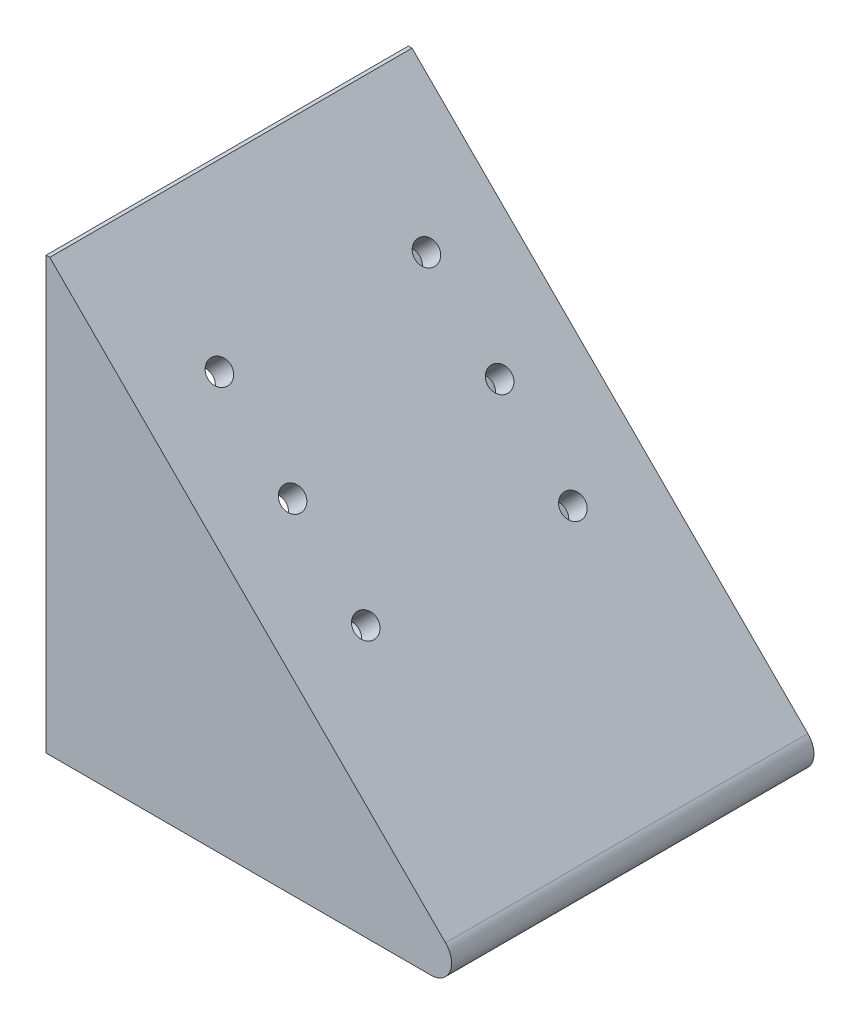
ISO-10303-21;
HEADER;
FILE_DESCRIPTION(('STEP AP214'),'2;1');
FILE_NAME('part.step','',(''),(''),'','','');
FILE_SCHEMA(('AUTOMOTIVE_DESIGN { 1 0 10303 214 1 1 1 1 }'));
ENDSEC;
DATA;
#1=APPLICATION_CONTEXT('core data for automotive mechanical design processes');
#2=APPLICATION_PROTOCOL_DEFINITION('international standard','automotive_design',2000,#1);
#3=PRODUCT_CONTEXT('',#1,'mechanical');
#4=PRODUCT('Part','Part','',(#3));
#5=PRODUCT_RELATED_PRODUCT_CATEGORY('part','',(#4));
#6=PRODUCT_DEFINITION_FORMATION('','',#4);
#7=PRODUCT_DEFINITION_CONTEXT('part definition',#1,'design');
#8=PRODUCT_DEFINITION('design','',#6,#7);
#9=PRODUCT_DEFINITION_SHAPE('','',#8);
#10=(LENGTH_UNIT() NAMED_UNIT(*) SI_UNIT(.MILLI.,.METRE.));
#11=(NAMED_UNIT(*) PLANE_ANGLE_UNIT() SI_UNIT($,.RADIAN.));
#12=(NAMED_UNIT(*) SI_UNIT($,.STERADIAN.) SOLID_ANGLE_UNIT());
#13=UNCERTAINTY_MEASURE_WITH_UNIT(LENGTH_MEASURE(1.E-05),#10,'distance_accuracy_value','');
#14=(GEOMETRIC_REPRESENTATION_CONTEXT(3) GLOBAL_UNCERTAINTY_ASSIGNED_CONTEXT((#13)) GLOBAL_UNIT_ASSIGNED_CONTEXT((#10,
#11,#12)) REPRESENTATION_CONTEXT('',''));
#15=CARTESIAN_POINT('',(0.,0.,0.));
#16=DIRECTION('',(0.,0.,1.));
#17=DIRECTION('',(1.,0.,0.));
#18=AXIS2_PLACEMENT_3D('',#15,#16,#17);
#19=CARTESIAN_POINT('',(0.,84.,70.));
#20=DIRECTION('',(1.,0.,0.));
#21=DIRECTION('',(0.,1.,0.));
#22=AXIS2_PLACEMENT_3D('',#19,#20,#21);
#23=PLANE('',#22);
#24=DIRECTION('',(0.,-1.,0.));
#25=VECTOR('',#24,1.);
#26=CARTESIAN_POINT('',(0.,84.,5.));
#27=LINE('',#26,#25);
#28=CARTESIAN_POINT('',(0.,76.9289321881346,5.));
#29=VERTEX_POINT('',#28);
#30=CARTESIAN_POINT('',(0.,5.,5.));
#31=VERTEX_POINT('',#30);
#32=EDGE_CURVE('E118',#29,#31,#27,.T.);
#33=ORIENTED_EDGE('',*,*,#32,.F.);
#34=DIRECTION('',(0.,0.,1.));
#35=VECTOR('',#34,1.);
#36=CARTESIAN_POINT('',(0.,76.9289321881345,70.));
#37=LINE('',#36,#35);
#38=CARTESIAN_POINT('',(0.,76.9289321881345,65.));
#39=VERTEX_POINT('',#38);
#40=EDGE_CURVE('E111',#29,#39,#37,.T.);
#41=ORIENTED_EDGE('',*,*,#40,.T.);
#42=DIRECTION('',(0.,-1.,0.));
#43=VECTOR('',#42,1.);
#44=CARTESIAN_POINT('',(0.,84.,65.));
#45=LINE('',#44,#43);
#46=CARTESIAN_POINT('',(0.,5.,65.));
#47=VERTEX_POINT('',#46);
#48=EDGE_CURVE('E114',#39,#47,#45,.T.);
#49=ORIENTED_EDGE('',*,*,#48,.T.);
#50=DIRECTION('',(0.,0.,-1.));
#51=VECTOR('',#50,1.);
#52=CARTESIAN_POINT('',(0.,5.,70.));
#53=LINE('',#52,#51);
#54=EDGE_CURVE('E52',#47,#31,#53,.T.);
#55=ORIENTED_EDGE('',*,*,#54,.T.);
#56=EDGE_LOOP('',(#33,#41,#49,#55));
#57=FACE_BOUND('',#56,.T.);
#58=DIRECTION('',(0.,-1.,0.));
#59=VECTOR('',#58,1.);
#60=CARTESIAN_POINT('',(0.,84.,70.));
#61=LINE('',#60,#59);
#62=CARTESIAN_POINT('',(0.,83.2928932188135,70.));
#63=VERTEX_POINT('',#62);
#64=CARTESIAN_POINT('',(0.,0.,70.));
#65=VERTEX_POINT('',#64);
#66=EDGE_CURVE('E135',#63,#65,#61,.T.);
#67=ORIENTED_EDGE('',*,*,#66,.F.);
#68=DIRECTION('',(0.,0.,-1.));
#69=VECTOR('',#68,1.);
#70=CARTESIAN_POINT('',(0.,83.2928932188135,70.));
#71=LINE('',#70,#69);
#72=CARTESIAN_POINT('',(0.,83.2928932188135,0.));
#73=VERTEX_POINT('',#72);
#74=EDGE_CURVE('E160',#63,#73,#71,.T.);
#75=ORIENTED_EDGE('',*,*,#74,.T.);
#76=DIRECTION('',(0.,-1.,0.));
#77=VECTOR('',#76,1.);
#78=CARTESIAN_POINT('',(0.,84.,0.));
#79=LINE('',#78,#77);
#80=CARTESIAN_POINT('',(0.,0.,0.));
#81=VERTEX_POINT('',#80);
#82=EDGE_CURVE('E123',#73,#81,#79,.T.);
#83=ORIENTED_EDGE('',*,*,#82,.T.);
#84=DIRECTION('',(0.,0.,-1.));
#85=VECTOR('',#84,1.);
#86=CARTESIAN_POINT('',(0.,0.,70.));
#87=LINE('',#86,#85);
#88=EDGE_CURVE('E143',#65,#81,#87,.T.);
#89=ORIENTED_EDGE('',*,*,#88,.F.);
#90=EDGE_LOOP('',(#67,#75,#83,#89));
#91=FACE_BOUND('',#90,.T.);
#92=ADVANCED_FACE('F35',(#57,#91),#23,.F.);
#93=CARTESIAN_POINT('',(0.,0.,70.));
#94=DIRECTION('',(0.,1.,0.));
#95=DIRECTION('',(0.,0.,1.));
#96=AXIS2_PLACEMENT_3D('',#93,#94,#95);
#97=PLANE('',#96);
#98=DIRECTION('',(1.,0.,0.));
#99=VECTOR('',#98,1.);
#100=CARTESIAN_POINT('',(0.,0.,0.));
#101=LINE('',#100,#99);
#102=CARTESIAN_POINT('',(74.3431457505076,0.,0.));
#103=VERTEX_POINT('',#102);
#104=EDGE_CURVE('E145',#81,#103,#101,.T.);
#105=ORIENTED_EDGE('',*,*,#104,.T.);
#106=DIRECTION('',(0.,0.,-1.));
#107=VECTOR('',#106,1.);
#108=CARTESIAN_POINT('',(74.3431457505076,0.,70.));
#109=LINE('',#108,#107);
#110=CARTESIAN_POINT('',(74.3431457505076,0.,70.));
#111=VERTEX_POINT('',#110);
#112=EDGE_CURVE('E156',#103,#111,#109,.F.);
#113=ORIENTED_EDGE('',*,*,#112,.T.);
#114=DIRECTION('',(1.,0.,0.));
#115=VECTOR('',#114,1.);
#116=CARTESIAN_POINT('',(0.,0.,70.));
#117=LINE('',#116,#115);
#118=EDGE_CURVE('E137',#65,#111,#117,.T.);
#119=ORIENTED_EDGE('',*,*,#118,.F.);
#120=ORIENTED_EDGE('',*,*,#88,.T.);
#121=EDGE_LOOP('',(#105,#113,#119,#120));
#122=FACE_BOUND('',#121,.T.);
#123=ADVANCED_FACE('F210',(#122),#97,.F.);
#124=CARTESIAN_POINT('',(84.,0.,70.));
#125=DIRECTION('',(-0.707106781186548,-0.707106781186548,0.));
#126=DIRECTION('',(0.707106781186548,-0.707106781186548,0.));
#127=AXIS2_PLACEMENT_3D('',#124,#125,#126);
#128=PLANE('',#127);
#129=CARTESIAN_POINT('',(18.4817100367704,65.5182899632297,55.));
#130=DIRECTION('',(0.707106781186548,0.707106781186547,0.));
#131=DIRECTION('',(-0.707106781186547,0.707106781186548,0.));
#132=AXIS2_PLACEMENT_3D('',#129,#130,#131);
#133=CIRCLE('',#132,2.25);
#134=CARTESIAN_POINT('',(16.8907197791006,67.1092802208994,55.));
#135=VERTEX_POINT('',#134);
#136=EDGE_CURVE('E287',#135,#135,#133,.T.);
#137=ORIENTED_EDGE('',*,*,#136,.F.);
#138=EDGE_LOOP('',(#137));
#139=FACE_BOUND('',#138,.T.);
#140=CARTESIAN_POINT('',(32.6238456605013,51.3761543394987,55.));
#141=DIRECTION('',(0.707106781186548,0.707106781186547,0.));
#142=DIRECTION('',(-0.707106781186547,0.707106781186548,0.));
#143=AXIS2_PLACEMENT_3D('',#140,#141,#142);
#144=CIRCLE('',#143,2.25);
#145=CARTESIAN_POINT('',(31.0328554028316,52.9671445971685,55.));
#146=VERTEX_POINT('',#145);
#147=EDGE_CURVE('E289',#146,#146,#144,.T.);
#148=ORIENTED_EDGE('',*,*,#147,.F.);
#149=EDGE_LOOP('',(#148));
#150=FACE_BOUND('',#149,.T.);
#151=CARTESIAN_POINT('',(46.7659812842323,37.2340187157678,55.));
#152=DIRECTION('',(0.707106781186548,0.707106781186547,0.));
#153=DIRECTION('',(-0.707106781186547,0.707106781186548,0.));
#154=AXIS2_PLACEMENT_3D('',#151,#152,#153);
#155=CIRCLE('',#154,2.25);
#156=CARTESIAN_POINT('',(45.1749910265625,38.8250089734375,55.));
#157=VERTEX_POINT('',#156);
#158=EDGE_CURVE('E180',#157,#157,#155,.T.);
#159=ORIENTED_EDGE('',*,*,#158,.F.);
#160=EDGE_LOOP('',(#159));
#161=FACE_BOUND('',#160,.T.);
#162=CARTESIAN_POINT('',(46.7659812842323,37.2340187157678,15.));
#163=DIRECTION('',(0.707106781186548,0.707106781186547,0.));
#164=DIRECTION('',(-0.707106781186547,0.707106781186548,0.));
#165=AXIS2_PLACEMENT_3D('',#162,#163,#164);
#166=CIRCLE('',#165,2.25);
#167=CARTESIAN_POINT('',(45.1749910265625,38.8250089734375,15.));
#168=VERTEX_POINT('',#167);
#169=EDGE_CURVE('E168',#168,#168,#166,.T.);
#170=ORIENTED_EDGE('',*,*,#169,.F.);
#171=EDGE_LOOP('',(#170));
#172=FACE_BOUND('',#171,.T.);
#173=CARTESIAN_POINT('',(32.6238456605013,51.3761543394987,15.));
#174=DIRECTION('',(0.707106781186548,0.707106781186547,0.));
#175=DIRECTION('',(-0.707106781186547,0.707106781186548,0.));
#176=AXIS2_PLACEMENT_3D('',#173,#174,#175);
#177=CIRCLE('',#176,2.25);
#178=CARTESIAN_POINT('',(31.0328554028316,52.9671445971685,15.));
#179=VERTEX_POINT('',#178);
#180=EDGE_CURVE('E167',#179,#179,#177,.T.);
#181=ORIENTED_EDGE('',*,*,#180,.F.);
#182=EDGE_LOOP('',(#181));
#183=FACE_BOUND('',#182,.T.);
#184=CARTESIAN_POINT('',(18.4817100367704,65.5182899632297,15.));
#185=DIRECTION('',(0.707106781186548,0.707106781186547,0.));
#186=DIRECTION('',(-0.707106781186547,0.707106781186548,0.));
#187=AXIS2_PLACEMENT_3D('',#184,#185,#186);
#188=CIRCLE('',#187,2.25);
#189=CARTESIAN_POINT('',(16.8907197791006,67.1092802208994,15.));
#190=VERTEX_POINT('',#189);
#191=EDGE_CURVE('E186',#190,#190,#188,.T.);
#192=ORIENTED_EDGE('',*,*,#191,.F.);
#193=EDGE_LOOP('',(#192));
#194=FACE_BOUND('',#193,.T.);
#195=DIRECTION('',(-0.707106781186548,0.707106781186548,0.));
#196=VECTOR('',#195,1.);
#197=CARTESIAN_POINT('',(84.,0.,0.));
#198=LINE('',#197,#196);
#199=CARTESIAN_POINT('',(77.1715728752538,6.8284271247462,0.));
#200=VERTEX_POINT('',#199);
#201=CARTESIAN_POINT('',(0.707106781186531,83.2928932188135,0.));
#202=VERTEX_POINT('',#201);
#203=EDGE_CURVE('E138',#200,#202,#198,.T.);
#204=ORIENTED_EDGE('',*,*,#203,.T.);
#205=DIRECTION('',(0.,0.,1.));
#206=VECTOR('',#205,1.);
#207=CARTESIAN_POINT('',(0.707106781186545,83.2928932188135,70.));
#208=LINE('',#207,#206);
#209=CARTESIAN_POINT('',(0.707106781186545,83.2928932188135,70.));
#210=VERTEX_POINT('',#209);
#211=EDGE_CURVE('E44',#202,#210,#208,.T.);
#212=ORIENTED_EDGE('',*,*,#211,.T.);
#213=DIRECTION('',(-0.707106781186548,0.707106781186548,0.));
#214=VECTOR('',#213,1.);
#215=CARTESIAN_POINT('',(84.,0.,70.));
#216=LINE('',#215,#214);
#217=CARTESIAN_POINT('',(77.1715728752538,6.8284271247462,70.));
#218=VERTEX_POINT('',#217);
#219=EDGE_CURVE('E141',#218,#210,#216,.T.);
#220=ORIENTED_EDGE('',*,*,#219,.F.);
#221=DIRECTION('',(0.,0.,-1.));
#222=VECTOR('',#221,1.);
#223=CARTESIAN_POINT('',(77.1715728752538,6.8284271247462,70.));
#224=LINE('',#223,#222);
#225=EDGE_CURVE('E151',#218,#200,#224,.T.);
#226=ORIENTED_EDGE('',*,*,#225,.T.);
#227=EDGE_LOOP('',(#204,#212,#220,#226));
#228=FACE_BOUND('',#227,.T.);
#229=ADVANCED_FACE('F217',(#139,#150,#161,#172,#183,#194,#228),#128,.F.);
#230=CARTESIAN_POINT('',(0.,0.,70.));
#231=DIRECTION('',(0.,0.,1.));
#232=DIRECTION('',(1.,0.,0.));
#233=AXIS2_PLACEMENT_3D('',#230,#231,#232);
#234=PLANE('',#233);
#235=ORIENTED_EDGE('',*,*,#219,.T.);
#236=DIRECTION('',(1.,0.,0.));
#237=VECTOR('',#236,1.);
#238=CARTESIAN_POINT('',(0.,83.2928932188135,70.));
#239=LINE('',#238,#237);
#240=EDGE_CURVE('E11',#210,#63,#239,.F.);
#241=ORIENTED_EDGE('',*,*,#240,.T.);
#242=ORIENTED_EDGE('',*,*,#66,.T.);
#243=ORIENTED_EDGE('',*,*,#118,.T.);
#244=CARTESIAN_POINT('',(74.3431457505076,4.,70.));
#245=DIRECTION('',(0.,0.,1.));
#246=DIRECTION('',(1.,0.,0.));
#247=AXIS2_PLACEMENT_3D('',#244,#245,#246);
#248=CIRCLE('',#247,4.);
#249=EDGE_CURVE('E158',#111,#218,#248,.T.);
#250=ORIENTED_EDGE('',*,*,#249,.T.);
#251=EDGE_LOOP('',(#235,#241,#242,#243,#250));
#252=FACE_BOUND('',#251,.T.);
#253=ADVANCED_FACE('F232',(#252),#234,.T.);
#254=CARTESIAN_POINT('',(0.,0.,0.));
#255=DIRECTION('',(0.,0.,1.));
#256=DIRECTION('',(1.,0.,0.));
#257=AXIS2_PLACEMENT_3D('',#254,#255,#256);
#258=PLANE('',#257);
#259=ORIENTED_EDGE('',*,*,#82,.F.);
#260=DIRECTION('',(-1.,0.,0.));
#261=VECTOR('',#260,1.);
#262=CARTESIAN_POINT('',(0.,83.2928932188135,0.));
#263=LINE('',#262,#261);
#264=EDGE_CURVE('E163',#73,#202,#263,.F.);
#265=ORIENTED_EDGE('',*,*,#264,.T.);
#266=ORIENTED_EDGE('',*,*,#203,.F.);
#267=CARTESIAN_POINT('',(74.3431457505076,4.,0.));
#268=DIRECTION('',(0.,0.,1.));
#269=DIRECTION('',(1.,0.,0.));
#270=AXIS2_PLACEMENT_3D('',#267,#268,#269);
#271=CIRCLE('',#270,4.);
#272=EDGE_CURVE('E154',#200,#103,#271,.F.);
#273=ORIENTED_EDGE('',*,*,#272,.T.);
#274=ORIENTED_EDGE('',*,*,#104,.F.);
#275=EDGE_LOOP('',(#259,#265,#266,#273,#274));
#276=FACE_BOUND('',#275,.T.);
#277=ADVANCED_FACE('F224',(#276),#258,.F.);
#278=CARTESIAN_POINT('',(74.3431457505076,4.,70.));
#279=DIRECTION('',(0.,0.,-1.));
#280=DIRECTION('',(-1.,0.,0.));
#281=AXIS2_PLACEMENT_3D('',#278,#279,#280);
#282=CYLINDRICAL_SURFACE('',#281,4.);
#283=ORIENTED_EDGE('',*,*,#249,.F.);
#284=ORIENTED_EDGE('',*,*,#112,.F.);
#285=ORIENTED_EDGE('',*,*,#272,.F.);
#286=ORIENTED_EDGE('',*,*,#225,.F.);
#287=EDGE_LOOP('',(#283,#284,#285,#286));
#288=FACE_BOUND('',#287,.T.);
#289=ADVANCED_FACE('F222',(#288),#282,.T.);
#290=CARTESIAN_POINT('',(0.,83.2928932188135,70.));
#291=DIRECTION('',(0.,-1.,0.));
#292=DIRECTION('',(0.,0.,-1.));
#293=AXIS2_PLACEMENT_3D('',#290,#291,#292);
#294=PLANE('',#293);
#295=ORIENTED_EDGE('',*,*,#240,.F.);
#296=ORIENTED_EDGE('',*,*,#211,.F.);
#297=ORIENTED_EDGE('',*,*,#264,.F.);
#298=ORIENTED_EDGE('',*,*,#74,.F.);
#299=EDGE_LOOP('',(#295,#296,#297,#298));
#300=FACE_BOUND('',#299,.T.);
#301=ADVANCED_FACE('F37',(#300),#294,.F.);
#302=CARTESIAN_POINT('',(0.,5.,70.));
#303=DIRECTION('',(0.,1.,0.));
#304=DIRECTION('',(0.,0.,1.));
#305=AXIS2_PLACEMENT_3D('',#302,#303,#304);
#306=PLANE('',#305);
#307=DIRECTION('',(1.,0.,0.));
#308=VECTOR('',#307,1.);
#309=CARTESIAN_POINT('',(0.,5.,5.));
#310=LINE('',#309,#308);
#311=CARTESIAN_POINT('',(71.9289321881345,5.,5.));
#312=VERTEX_POINT('',#311);
#313=EDGE_CURVE('E115',#31,#312,#310,.T.);
#314=ORIENTED_EDGE('',*,*,#313,.F.);
#315=ORIENTED_EDGE('',*,*,#54,.F.);
#316=DIRECTION('',(1.,0.,0.));
#317=VECTOR('',#316,1.);
#318=CARTESIAN_POINT('',(0.,5.,65.));
#319=LINE('',#318,#317);
#320=CARTESIAN_POINT('',(71.9289321881345,5.,65.));
#321=VERTEX_POINT('',#320);
#322=EDGE_CURVE('E121',#47,#321,#319,.T.);
#323=ORIENTED_EDGE('',*,*,#322,.T.);
#324=DIRECTION('',(0.,0.,1.));
#325=VECTOR('',#324,1.);
#326=CARTESIAN_POINT('',(71.9289321881345,5.,70.));
#327=LINE('',#326,#325);
#328=EDGE_CURVE('E109',#312,#321,#327,.T.);
#329=ORIENTED_EDGE('',*,*,#328,.F.);
#330=EDGE_LOOP('',(#314,#315,#323,#329));
#331=FACE_BOUND('',#330,.T.);
#332=ADVANCED_FACE('F120',(#331),#306,.T.);
#333=CARTESIAN_POINT('',(80.4644660940673,-3.53553390593274,70.));
#334=DIRECTION('',(-0.707106781186548,-0.707106781186548,0.));
#335=DIRECTION('',(0.707106781186548,-0.707106781186548,0.));
#336=AXIS2_PLACEMENT_3D('',#333,#334,#335);
#337=PLANE('',#336);
#338=CARTESIAN_POINT('',(14.9461761308376,61.9827560572969,55.));
#339=DIRECTION('',(-0.707106781186548,-0.707106781186548,0.));
#340=DIRECTION('',(0.707106781186548,-0.707106781186548,0.));
#341=AXIS2_PLACEMENT_3D('',#338,#339,#340);
#342=CIRCLE('',#341,2.25);
#343=CARTESIAN_POINT('',(16.5371663885073,60.3917657996272,55.));
#344=VERTEX_POINT('',#343);
#345=EDGE_CURVE('E285',#344,#344,#342,.T.);
#346=ORIENTED_EDGE('',*,*,#345,.F.);
#347=EDGE_LOOP('',(#346));
#348=FACE_BOUND('',#347,.T.);
#349=CARTESIAN_POINT('',(29.0883117545686,47.840620433566,55.));
#350=DIRECTION('',(-0.707106781186548,-0.707106781186548,0.));
#351=DIRECTION('',(0.707106781186548,-0.707106781186548,0.));
#352=AXIS2_PLACEMENT_3D('',#349,#350,#351);
#353=CIRCLE('',#352,2.25);
#354=CARTESIAN_POINT('',(30.6793020122383,46.2496301758962,55.));
#355=VERTEX_POINT('',#354);
#356=EDGE_CURVE('E39',#355,#355,#353,.T.);
#357=ORIENTED_EDGE('',*,*,#356,.F.);
#358=EDGE_LOOP('',(#357));
#359=FACE_BOUND('',#358,.T.);
#360=CARTESIAN_POINT('',(43.2304473782995,33.698484809835,55.));
#361=DIRECTION('',(-0.707106781186548,-0.707106781186548,0.));
#362=DIRECTION('',(0.707106781186548,-0.707106781186548,0.));
#363=AXIS2_PLACEMENT_3D('',#360,#361,#362);
#364=CIRCLE('',#363,2.25);
#365=CARTESIAN_POINT('',(44.8214376359692,32.1074945521653,55.));
#366=VERTEX_POINT('',#365);
#367=EDGE_CURVE('E175',#366,#366,#364,.T.);
#368=ORIENTED_EDGE('',*,*,#367,.F.);
#369=EDGE_LOOP('',(#368));
#370=FACE_BOUND('',#369,.T.);
#371=CARTESIAN_POINT('',(43.2304473782995,33.698484809835,15.));
#372=DIRECTION('',(-0.707106781186548,-0.707106781186548,0.));
#373=DIRECTION('',(0.707106781186548,-0.707106781186548,0.));
#374=AXIS2_PLACEMENT_3D('',#371,#372,#373);
#375=CIRCLE('',#374,2.25);
#376=CARTESIAN_POINT('',(44.8214376359692,32.1074945521653,15.));
#377=VERTEX_POINT('',#376);
#378=EDGE_CURVE('E165',#377,#377,#375,.T.);
#379=ORIENTED_EDGE('',*,*,#378,.F.);
#380=EDGE_LOOP('',(#379));
#381=FACE_BOUND('',#380,.T.);
#382=CARTESIAN_POINT('',(29.0883117545686,47.840620433566,15.));
#383=DIRECTION('',(-0.707106781186548,-0.707106781186548,0.));
#384=DIRECTION('',(0.707106781186548,-0.707106781186548,0.));
#385=AXIS2_PLACEMENT_3D('',#382,#383,#384);
#386=CIRCLE('',#385,2.25);
#387=CARTESIAN_POINT('',(30.6793020122383,46.2496301758962,15.));
#388=VERTEX_POINT('',#387);
#389=EDGE_CURVE('E172',#388,#388,#386,.T.);
#390=ORIENTED_EDGE('',*,*,#389,.F.);
#391=EDGE_LOOP('',(#390));
#392=FACE_BOUND('',#391,.T.);
#393=CARTESIAN_POINT('',(14.9461761308376,61.9827560572969,15.));
#394=DIRECTION('',(-0.707106781186548,-0.707106781186548,0.));
#395=DIRECTION('',(0.707106781186548,-0.707106781186548,0.));
#396=AXIS2_PLACEMENT_3D('',#393,#394,#395);
#397=CIRCLE('',#396,2.25);
#398=CARTESIAN_POINT('',(16.5371663885073,60.3917657996272,15.));
#399=VERTEX_POINT('',#398);
#400=EDGE_CURVE('E133',#399,#399,#397,.T.);
#401=ORIENTED_EDGE('',*,*,#400,.F.);
#402=EDGE_LOOP('',(#401));
#403=FACE_BOUND('',#402,.T.);
#404=DIRECTION('',(-0.707106781186548,0.707106781186548,0.));
#405=VECTOR('',#404,1.);
#406=CARTESIAN_POINT('',(80.4644660940673,-3.53553390593274,5.));
#407=LINE('',#406,#405);
#408=EDGE_CURVE('E104',#312,#29,#407,.T.);
#409=ORIENTED_EDGE('',*,*,#408,.F.);
#410=ORIENTED_EDGE('',*,*,#328,.T.);
#411=DIRECTION('',(-0.707106781186548,0.707106781186548,0.));
#412=VECTOR('',#411,1.);
#413=CARTESIAN_POINT('',(80.4644660940673,-3.53553390593274,65.));
#414=LINE('',#413,#412);
#415=EDGE_CURVE('E125',#321,#39,#414,.T.);
#416=ORIENTED_EDGE('',*,*,#415,.T.);
#417=ORIENTED_EDGE('',*,*,#40,.F.);
#418=EDGE_LOOP('',(#409,#410,#416,#417));
#419=FACE_BOUND('',#418,.T.);
#420=ADVANCED_FACE('F106',(#348,#359,#370,#381,#392,#403,#419),#337,.T.);
#421=CARTESIAN_POINT('',(0.,0.,65.));
#422=DIRECTION('',(0.,0.,1.));
#423=DIRECTION('',(1.,0.,0.));
#424=AXIS2_PLACEMENT_3D('',#421,#422,#423);
#425=PLANE('',#424);
#426=ORIENTED_EDGE('',*,*,#415,.F.);
#427=ORIENTED_EDGE('',*,*,#322,.F.);
#428=ORIENTED_EDGE('',*,*,#48,.F.);
#429=EDGE_LOOP('',(#426,#427,#428));
#430=FACE_BOUND('',#429,.T.);
#431=ADVANCED_FACE('F195',(#430),#425,.F.);
#432=CARTESIAN_POINT('',(0.,0.,5.));
#433=DIRECTION('',(0.,0.,1.));
#434=DIRECTION('',(1.,0.,0.));
#435=AXIS2_PLACEMENT_3D('',#432,#433,#434);
#436=PLANE('',#435);
#437=ORIENTED_EDGE('',*,*,#32,.T.);
#438=ORIENTED_EDGE('',*,*,#313,.T.);
#439=ORIENTED_EDGE('',*,*,#408,.T.);
#440=EDGE_LOOP('',(#437,#438,#439));
#441=FACE_BOUND('',#440,.T.);
#442=ADVANCED_FACE('F117',(#441),#436,.T.);
#443=CARTESIAN_POINT('',(18.4817100367704,65.5182899632297,15.));
#444=DIRECTION('',(0.707106781186548,0.707106781186547,0.));
#445=DIRECTION('',(-0.707106781186547,0.707106781186548,0.));
#446=AXIS2_PLACEMENT_3D('',#443,#444,#445);
#447=CYLINDRICAL_SURFACE('',#446,2.25);
#448=ORIENTED_EDGE('',*,*,#400,.T.);
#449=EDGE_LOOP('',(#448));
#450=FACE_BOUND('',#449,.T.);
#451=ORIENTED_EDGE('',*,*,#191,.T.);
#452=EDGE_LOOP('',(#451));
#453=FACE_BOUND('',#452,.T.);
#454=ADVANCED_FACE('F191',(#450,#453),#447,.F.);
#455=CARTESIAN_POINT('',(32.6238456605013,51.3761543394987,15.));
#456=DIRECTION('',(0.707106781186548,0.707106781186547,0.));
#457=DIRECTION('',(-0.707106781186547,0.707106781186548,0.));
#458=AXIS2_PLACEMENT_3D('',#455,#456,#457);
#459=CYLINDRICAL_SURFACE('',#458,2.25);
#460=ORIENTED_EDGE('',*,*,#389,.T.);
#461=EDGE_LOOP('',(#460));
#462=FACE_BOUND('',#461,.T.);
#463=ORIENTED_EDGE('',*,*,#180,.T.);
#464=EDGE_LOOP('',(#463));
#465=FACE_BOUND('',#464,.T.);
#466=ADVANCED_FACE('F259',(#462,#465),#459,.F.);
#467=CARTESIAN_POINT('',(46.7659812842323,37.2340187157678,15.));
#468=DIRECTION('',(0.707106781186548,0.707106781186547,0.));
#469=DIRECTION('',(-0.707106781186547,0.707106781186548,0.));
#470=AXIS2_PLACEMENT_3D('',#467,#468,#469);
#471=CYLINDRICAL_SURFACE('',#470,2.25);
#472=ORIENTED_EDGE('',*,*,#378,.T.);
#473=EDGE_LOOP('',(#472));
#474=FACE_BOUND('',#473,.T.);
#475=ORIENTED_EDGE('',*,*,#169,.T.);
#476=EDGE_LOOP('',(#475));
#477=FACE_BOUND('',#476,.T.);
#478=ADVANCED_FACE('F264',(#474,#477),#471,.F.);
#479=CARTESIAN_POINT('',(46.7659812842323,37.2340187157678,55.));
#480=DIRECTION('',(0.707106781186548,0.707106781186547,0.));
#481=DIRECTION('',(-0.707106781186547,0.707106781186548,0.));
#482=AXIS2_PLACEMENT_3D('',#479,#480,#481);
#483=CYLINDRICAL_SURFACE('',#482,2.25);
#484=ORIENTED_EDGE('',*,*,#367,.T.);
#485=EDGE_LOOP('',(#484));
#486=FACE_BOUND('',#485,.T.);
#487=ORIENTED_EDGE('',*,*,#158,.T.);
#488=EDGE_LOOP('',(#487));
#489=FACE_BOUND('',#488,.T.);
#490=ADVANCED_FACE('F270',(#486,#489),#483,.F.);
#491=CARTESIAN_POINT('',(32.6238456605013,51.3761543394987,55.));
#492=DIRECTION('',(0.707106781186548,0.707106781186547,0.));
#493=DIRECTION('',(-0.707106781186547,0.707106781186548,0.));
#494=AXIS2_PLACEMENT_3D('',#491,#492,#493);
#495=CYLINDRICAL_SURFACE('',#494,2.25);
#496=ORIENTED_EDGE('',*,*,#356,.T.);
#497=EDGE_LOOP('',(#496));
#498=FACE_BOUND('',#497,.T.);
#499=ORIENTED_EDGE('',*,*,#147,.T.);
#500=EDGE_LOOP('',(#499));
#501=FACE_BOUND('',#500,.T.);
#502=ADVANCED_FACE('F273',(#498,#501),#495,.F.);
#503=CARTESIAN_POINT('',(18.4817100367704,65.5182899632297,55.));
#504=DIRECTION('',(0.707106781186548,0.707106781186547,0.));
#505=DIRECTION('',(-0.707106781186547,0.707106781186548,0.));
#506=AXIS2_PLACEMENT_3D('',#503,#504,#505);
#507=CYLINDRICAL_SURFACE('',#506,2.25);
#508=ORIENTED_EDGE('',*,*,#345,.T.);
#509=EDGE_LOOP('',(#508));
#510=FACE_BOUND('',#509,.T.);
#511=ORIENTED_EDGE('',*,*,#136,.T.);
#512=EDGE_LOOP('',(#511));
#513=FACE_BOUND('',#512,.T.);
#514=ADVANCED_FACE('F277',(#510,#513),#507,.F.);
#515=CLOSED_SHELL('',(#92,#123,#229,#253,#277,#289,#301,#332,#420,#431,#442,#454,#466,#478,#490,
#502,#514));
#516=MANIFOLD_SOLID_BREP('B2',#515);
#517=ADVANCED_BREP_SHAPE_REPRESENTATION('',(#18,#516),#14);
#518=SHAPE_DEFINITION_REPRESENTATION(#9,#517);
ENDSEC;
END-ISO-10303-21;
